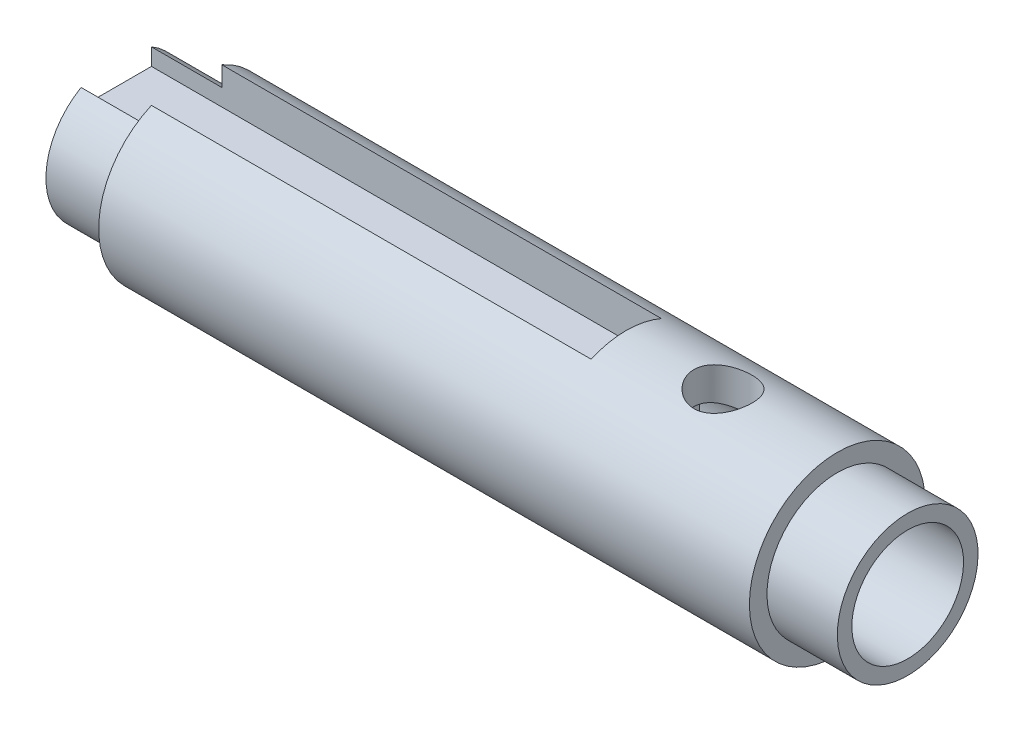
ISO-10303-21;
HEADER;
FILE_DESCRIPTION(('STEP AP214'),'2;1');
FILE_NAME('part.step','',(''),(''),'','','');
FILE_SCHEMA(('AUTOMOTIVE_DESIGN { 1 0 10303 214 1 1 1 1 }'));
ENDSEC;
DATA;
#1=APPLICATION_CONTEXT('core data for automotive mechanical design processes');
#2=APPLICATION_PROTOCOL_DEFINITION('international standard','automotive_design',2000,#1);
#3=PRODUCT_CONTEXT('',#1,'mechanical');
#4=PRODUCT('Part','Part','',(#3));
#5=PRODUCT_RELATED_PRODUCT_CATEGORY('part','',(#4));
#6=PRODUCT_DEFINITION_FORMATION('','',#4);
#7=PRODUCT_DEFINITION_CONTEXT('part definition',#1,'design');
#8=PRODUCT_DEFINITION('design','',#6,#7);
#9=PRODUCT_DEFINITION_SHAPE('','',#8);
#10=(LENGTH_UNIT() NAMED_UNIT(*) SI_UNIT(.MILLI.,.METRE.));
#11=(NAMED_UNIT(*) PLANE_ANGLE_UNIT() SI_UNIT($,.RADIAN.));
#12=(NAMED_UNIT(*) SI_UNIT($,.STERADIAN.) SOLID_ANGLE_UNIT());
#13=UNCERTAINTY_MEASURE_WITH_UNIT(LENGTH_MEASURE(1.E-05),#10,'distance_accuracy_value','');
#14=(GEOMETRIC_REPRESENTATION_CONTEXT(3) GLOBAL_UNCERTAINTY_ASSIGNED_CONTEXT((#13)) GLOBAL_UNIT_ASSIGNED_CONTEXT((#10,
#11,#12)) REPRESENTATION_CONTEXT('',''));
#15=CARTESIAN_POINT('',(0.,0.,0.));
#16=DIRECTION('',(0.,0.,1.));
#17=DIRECTION('',(1.,0.,0.));
#18=AXIS2_PLACEMENT_3D('',#15,#16,#17);
#19=CARTESIAN_POINT('',(22.5,0.,0.));
#20=DIRECTION('',(1.,0.,0.));
#21=DIRECTION('',(0.,1.,0.));
#22=AXIS2_PLACEMENT_3D('',#19,#20,#21);
#23=CYLINDRICAL_SURFACE('',#22,4.);
#24=CARTESIAN_POINT('',(18.5,0.,0.));
#25=DIRECTION('',(1.,0.,0.));
#26=DIRECTION('',(0.,1.,0.));
#27=AXIS2_PLACEMENT_3D('',#24,#25,#26);
#28=CIRCLE('',#27,4.);
#29=CARTESIAN_POINT('',(18.5,4.00000000000001,0.));
#30=VERTEX_POINT('',#29);
#31=EDGE_CURVE('E152',#30,#30,#28,.T.);
#32=ORIENTED_EDGE('',*,*,#31,.T.);
#33=EDGE_LOOP('',(#32));
#34=FACE_BOUND('',#33,.T.);
#35=CARTESIAN_POINT('',(22.5,0.,0.));
#36=DIRECTION('',(1.,0.,0.));
#37=DIRECTION('',(0.,1.,0.));
#38=AXIS2_PLACEMENT_3D('',#35,#36,#37);
#39=CIRCLE('',#38,4.);
#40=CARTESIAN_POINT('',(22.5,4.00000000000001,0.));
#41=VERTEX_POINT('',#40);
#42=EDGE_CURVE('E117',#41,#41,#39,.T.);
#43=ORIENTED_EDGE('',*,*,#42,.F.);
#44=EDGE_LOOP('',(#43));
#45=FACE_BOUND('',#44,.T.);
#46=ADVANCED_FACE('F41',(#34,#45),#23,.T.);
#47=CARTESIAN_POINT('',(22.5,0.,0.));
#48=DIRECTION('',(1.,0.,0.));
#49=DIRECTION('',(0.,1.,0.));
#50=AXIS2_PLACEMENT_3D('',#47,#48,#49);
#51=PLANE('',#50);
#52=CARTESIAN_POINT('',(22.5,0.,0.));
#53=DIRECTION('',(1.,0.,0.));
#54=DIRECTION('',(0.,1.,0.));
#55=AXIS2_PLACEMENT_3D('',#52,#53,#54);
#56=CIRCLE('',#55,3.175);
#57=CARTESIAN_POINT('',(22.5,3.17500000000001,0.));
#58=VERTEX_POINT('',#57);
#59=EDGE_CURVE('E159',#58,#58,#56,.T.);
#60=ORIENTED_EDGE('',*,*,#59,.F.);
#61=EDGE_LOOP('',(#60));
#62=FACE_BOUND('',#61,.T.);
#63=ORIENTED_EDGE('',*,*,#42,.T.);
#64=EDGE_LOOP('',(#63));
#65=FACE_BOUND('',#64,.T.);
#66=ADVANCED_FACE('F141',(#62,#65),#51,.T.);
#67=CARTESIAN_POINT('',(-22.5,0.,0.));
#68=DIRECTION('',(-1.,0.,0.));
#69=DIRECTION('',(0.,-1.,0.));
#70=AXIS2_PLACEMENT_3D('',#67,#68,#69);
#71=PLANE('',#70);
#72=DIRECTION('',(0.,1.,0.));
#73=VECTOR('',#72,1.);
#74=CARTESIAN_POINT('',(-22.5,0.,2.));
#75=LINE('',#74,#73);
#76=CARTESIAN_POINT('',(-22.5,2.49999999999999,2.));
#77=VERTEX_POINT('',#76);
#78=CARTESIAN_POINT('',(-22.5,3.46410161513775,2.));
#79=VERTEX_POINT('',#78);
#80=EDGE_CURVE('E62',#77,#79,#75,.T.);
#81=ORIENTED_EDGE('',*,*,#80,.F.);
#82=DIRECTION('',(0.,0.,1.));
#83=VECTOR('',#82,1.);
#84=CARTESIAN_POINT('',(-22.5,2.49999999999999,0.));
#85=LINE('',#84,#83);
#86=CARTESIAN_POINT('',(-22.5,2.49999999999999,-2.));
#87=VERTEX_POINT('',#86);
#88=EDGE_CURVE('E12',#87,#77,#85,.T.);
#89=ORIENTED_EDGE('',*,*,#88,.F.);
#90=DIRECTION('',(0.,1.,0.));
#91=VECTOR('',#90,1.);
#92=CARTESIAN_POINT('',(-22.5,0.,-2.));
#93=LINE('',#92,#91);
#94=CARTESIAN_POINT('',(-22.5,3.46410161513775,-2.));
#95=VERTEX_POINT('',#94);
#96=EDGE_CURVE('E234',#87,#95,#93,.T.);
#97=ORIENTED_EDGE('',*,*,#96,.T.);
#98=CARTESIAN_POINT('',(-22.5,0.,0.));
#99=DIRECTION('',(1.,0.,0.));
#100=DIRECTION('',(0.,1.,0.));
#101=AXIS2_PLACEMENT_3D('',#98,#99,#100);
#102=CIRCLE('',#101,4.);
#103=EDGE_CURVE('E132',#79,#95,#102,.T.);
#104=ORIENTED_EDGE('',*,*,#103,.F.);
#105=EDGE_LOOP('',(#81,#89,#97,#104));
#106=FACE_BOUND('',#105,.T.);
#107=ADVANCED_FACE('F148',(#106),#71,.T.);
#108=CARTESIAN_POINT('',(22.5,0.,0.));
#109=DIRECTION('',(1.,0.,0.));
#110=DIRECTION('',(0.,1.,0.));
#111=AXIS2_PLACEMENT_3D('',#108,#109,#110);
#112=CYLINDRICAL_SURFACE('',#111,4.);
#113=DIRECTION('',(1.,0.,0.));
#114=VECTOR('',#113,1.);
#115=CARTESIAN_POINT('',(22.5,3.46410161513776,2.));
#116=LINE('',#115,#114);
#117=CARTESIAN_POINT('',(-18.5,3.46410161513775,2.));
#118=VERTEX_POINT('',#117);
#119=EDGE_CURVE('E170',#79,#118,#116,.T.);
#120=ORIENTED_EDGE('',*,*,#119,.F.);
#121=ORIENTED_EDGE('',*,*,#103,.T.);
#122=DIRECTION('',(1.,0.,0.));
#123=VECTOR('',#122,1.);
#124=CARTESIAN_POINT('',(22.5,3.46410161513776,-2.));
#125=LINE('',#124,#123);
#126=CARTESIAN_POINT('',(-18.5,3.46410161513775,-2.));
#127=VERTEX_POINT('',#126);
#128=EDGE_CURVE('E237',#95,#127,#125,.T.);
#129=ORIENTED_EDGE('',*,*,#128,.T.);
#130=CARTESIAN_POINT('',(-18.5,0.,0.));
#131=DIRECTION('',(1.,0.,0.));
#132=DIRECTION('',(0.,1.,0.));
#133=AXIS2_PLACEMENT_3D('',#130,#131,#132);
#134=CIRCLE('',#133,4.);
#135=EDGE_CURVE('E136',#118,#127,#134,.T.);
#136=ORIENTED_EDGE('',*,*,#135,.F.);
#137=EDGE_LOOP('',(#120,#121,#129,#136));
#138=FACE_BOUND('',#137,.T.);
#139=ADVANCED_FACE('F222',(#138),#112,.T.);
#140=CARTESIAN_POINT('',(-18.5,3.99999999999999,0.));
#141=DIRECTION('',(-1.,0.,0.));
#142=DIRECTION('',(0.,-1.,0.));
#143=AXIS2_PLACEMENT_3D('',#140,#141,#142);
#144=PLANE('',#143);
#145=DIRECTION('',(0.,1.,0.));
#146=VECTOR('',#145,1.);
#147=CARTESIAN_POINT('',(-18.5,3.99999999999999,2.));
#148=LINE('',#147,#146);
#149=CARTESIAN_POINT('',(-18.5,4.58257569495583,2.));
#150=VERTEX_POINT('',#149);
#151=EDGE_CURVE('E174',#118,#150,#148,.T.);
#152=ORIENTED_EDGE('',*,*,#151,.F.);
#153=ORIENTED_EDGE('',*,*,#135,.T.);
#154=DIRECTION('',(0.,1.,0.));
#155=VECTOR('',#154,1.);
#156=CARTESIAN_POINT('',(-18.5,3.99999999999999,-2.));
#157=LINE('',#156,#155);
#158=CARTESIAN_POINT('',(-18.5,4.58257569495583,-2.));
#159=VERTEX_POINT('',#158);
#160=EDGE_CURVE('E240',#127,#159,#157,.T.);
#161=ORIENTED_EDGE('',*,*,#160,.T.);
#162=CARTESIAN_POINT('',(-18.5,0.,0.));
#163=DIRECTION('',(1.,0.,0.));
#164=DIRECTION('',(0.,1.,0.));
#165=AXIS2_PLACEMENT_3D('',#162,#163,#164);
#166=CIRCLE('',#165,5.);
#167=EDGE_CURVE('E113',#150,#159,#166,.T.);
#168=ORIENTED_EDGE('',*,*,#167,.F.);
#169=EDGE_LOOP('',(#152,#153,#161,#168));
#170=FACE_BOUND('',#169,.T.);
#171=ADVANCED_FACE('F217',(#170),#144,.T.);
#172=CARTESIAN_POINT('',(22.5,0.,0.));
#173=DIRECTION('',(1.,0.,0.));
#174=DIRECTION('',(0.,1.,0.));
#175=AXIS2_PLACEMENT_3D('',#172,#173,#174);
#176=CYLINDRICAL_SURFACE('',#175,5.);
#177=DIRECTION('',(1.,0.,0.));
#178=VECTOR('',#177,1.);
#179=CARTESIAN_POINT('',(22.5,4.58257569495585,2.));
#180=LINE('',#179,#178);
#181=CARTESIAN_POINT('',(6.5,4.58257569495584,2.));
#182=VERTEX_POINT('',#181);
#183=EDGE_CURVE('E47',#150,#182,#180,.T.);
#184=ORIENTED_EDGE('',*,*,#183,.F.);
#185=ORIENTED_EDGE('',*,*,#167,.T.);
#186=DIRECTION('',(1.,0.,0.));
#187=VECTOR('',#186,1.);
#188=CARTESIAN_POINT('',(22.5,4.58257569495585,-2.));
#189=LINE('',#188,#187);
#190=CARTESIAN_POINT('',(6.5,4.58257569495584,-2.));
#191=VERTEX_POINT('',#190);
#192=EDGE_CURVE('E96',#159,#191,#189,.T.);
#193=ORIENTED_EDGE('',*,*,#192,.T.);
#194=CARTESIAN_POINT('',(6.5,0.,0.));
#195=DIRECTION('',(-1.,0.,0.));
#196=DIRECTION('',(0.,-1.,0.));
#197=AXIS2_PLACEMENT_3D('',#194,#195,#196);
#198=CIRCLE('',#197,5.);
#199=EDGE_CURVE('E102',#182,#191,#198,.T.);
#200=ORIENTED_EDGE('',*,*,#199,.F.);
#201=EDGE_LOOP('',(#184,#185,#193,#200));
#202=FACE_BOUND('',#201,.T.);
#203=CARTESIAN_POINT('',(10.35,5.,0.));
#204=CARTESIAN_POINT('',(10.3499997574856,5.00000012564882,0.0900803323989867));
#205=CARTESIAN_POINT('',(10.357400837485,4.99754312617874,0.180159574077353));
#206=CARTESIAN_POINT('',(10.3867211495276,4.98798348171153,0.357667875169257));
#207=CARTESIAN_POINT('',(10.4086421758353,4.98088026257135,0.44509660565632));
#208=CARTESIAN_POINT('',(10.4661713123883,4.96280068143201,0.614719075952392));
#209=CARTESIAN_POINT('',(10.501756817014,4.95183071876684,0.696921201899964));
#210=CARTESIAN_POINT('',(10.5855035726919,4.92713947248839,0.854190645874481));
#211=CARTESIAN_POINT('',(10.6336672263034,4.91341766335966,0.929256597076052));
#212=CARTESIAN_POINT('',(10.7429248230714,4.88414667976015,1.07267700256014));
#213=CARTESIAN_POINT('',(10.8043700182742,4.86855436886588,1.140755021368));
#214=CARTESIAN_POINT('',(10.9376995139198,4.83753907804007,1.26585047260417));
#215=CARTESIAN_POINT('',(11.0095860466927,4.8221161350793,1.32286553369749));
#216=CARTESIAN_POINT('',(11.1642306123795,4.79271313173334,1.42578155512387));
#217=CARTESIAN_POINT('',(11.2472372375852,4.77878574898836,1.47132547146369));
#218=CARTESIAN_POINT('',(11.4202656308341,4.75460549483772,1.5476895000705));
#219=CARTESIAN_POINT('',(11.5102852973523,4.74435152777497,1.57851400356115));
#220=CARTESIAN_POINT('',(11.6916448290813,4.72913282635101,1.62353134991423));
#221=CARTESIAN_POINT('',(11.7828421633256,4.72400412235767,1.6382413417332));
#222=CARTESIAN_POINT('',(11.966543612694,4.7191313464795,1.65222861163855));
#223=CARTESIAN_POINT('',(12.0590473250677,4.71938564975367,1.65151054662635));
#224=CARTESIAN_POINT('',(12.2383472023923,4.72510629107569,1.63506410098719));
#225=CARTESIAN_POINT('',(12.3252137352388,4.73033928879682,1.62000769651632));
#226=CARTESIAN_POINT('',(12.4951109061667,4.74504632523488,1.57640708934977));
#227=CARTESIAN_POINT('',(12.5781410922653,4.75452086227439,1.54786130181506));
#228=CARTESIAN_POINT('',(12.7395474399946,4.77681173941001,1.47764674240872));
#229=CARTESIAN_POINT('',(12.8178288502253,4.78967871947684,1.43577693123635));
#230=CARTESIAN_POINT('',(12.9664683623015,4.81728315916033,1.34024242388314));
#231=CARTESIAN_POINT('',(13.0368242036941,4.83202114987191,1.28657437554158));
#232=CARTESIAN_POINT('',(13.1713952274102,4.86262798242567,1.16572801734404));
#233=CARTESIAN_POINT('',(13.2351128786431,4.87851612594017,1.09799945388895));
#234=CARTESIAN_POINT('',(13.3504141782392,4.9089733458653,0.952622363558083));
#235=CARTESIAN_POINT('',(13.401996708755,4.92354230068064,0.874972923819716));
#236=CARTESIAN_POINT('',(13.491953516837,4.9499042925994,0.710918878360193));
#237=CARTESIAN_POINT('',(13.530196897213,4.96166947936115,0.624437715003006));
#238=CARTESIAN_POINT('',(13.5914397196063,4.98089634514735,0.445788820584336));
#239=CARTESIAN_POINT('',(13.6144443470641,4.98835948795835,0.353623035566634));
#240=CARTESIAN_POINT('',(13.6436807853833,4.9979000192954,0.17043493694281));
#241=CARTESIAN_POINT('',(13.6505850936395,5.0001932084094,0.0795310449403316));
#242=CARTESIAN_POINT('',(13.6493373673087,4.99978120399321,-0.10215299707419));
#243=CARTESIAN_POINT('',(13.6411878171332,4.99707683523428,-0.19293316503069));
#244=CARTESIAN_POINT('',(13.6105971738171,4.98711592890817,-0.369117276094976));
#245=CARTESIAN_POINT('',(13.5885667899855,4.97999029806496,-0.454600657078433));
#246=CARTESIAN_POINT('',(13.5313513084882,4.96203610216641,-0.620625393385987));
#247=CARTESIAN_POINT('',(13.4961645401181,4.9512070668376,-0.701166119538831));
#248=CARTESIAN_POINT('',(13.4126189804476,4.92659738190257,-0.857353583850655));
#249=CARTESIAN_POINT('',(13.3639413852355,4.91274728599484,-0.932818538636807));
#250=CARTESIAN_POINT('',(13.2551717652041,4.8836680633903,-1.07472879779132));
#251=CARTESIAN_POINT('',(13.195076316326,4.86843852373584,-1.14117138619964));
#252=CARTESIAN_POINT('',(13.062013827308,4.83745909847492,-1.26622547851876));
#253=CARTESIAN_POINT('',(12.9885931330763,4.82171620160003,-1.32435715949936));
#254=CARTESIAN_POINT('',(12.8327001451063,4.79218567046633,-1.42753142742357));
#255=CARTESIAN_POINT('',(12.7502278168408,4.77839804366633,-1.47257396443646));
#256=CARTESIAN_POINT('',(12.5785745160417,4.75447746870334,-1.54806908435207));
#257=CARTESIAN_POINT('',(12.4894100140228,4.74433588191366,-1.57855621066784));
#258=CARTESIAN_POINT('',(12.3068020979204,4.728992662468,-1.62395003915295));
#259=CARTESIAN_POINT('',(12.213360579788,4.72378886275909,-1.63886357641239));
#260=CARTESIAN_POINT('',(12.0299145750871,4.71915352744858,-1.65216049477083));
#261=CARTESIAN_POINT('',(11.9399740636218,4.71944442417867,-1.6513387236508));
#262=CARTESIAN_POINT('',(11.7615834004099,4.72508139490563,-1.63513842564513));
#263=CARTESIAN_POINT('',(11.6731331635849,4.7304271793221,-1.61976073262755));
#264=CARTESIAN_POINT('',(11.5018358628154,4.74536693764462,-1.57544291875231));
#265=CARTESIAN_POINT('',(11.4189160278425,4.75488165289365,-1.54675527092969));
#266=CARTESIAN_POINT('',(11.2590025073374,4.77705935615134,-1.47683540940045));
#267=CARTESIAN_POINT('',(11.1820101250481,4.78972303393434,-1.43560044678476));
#268=CARTESIAN_POINT('',(11.0325565456336,4.81744939348764,-1.33969084183065));
#269=CARTESIAN_POINT('',(10.9604315889302,4.8325917044349,-1.28451538865981));
#270=CARTESIAN_POINT('',(10.826207419325,4.86323043063064,-1.16314331347536));
#271=CARTESIAN_POINT('',(10.7641110248733,4.87872694403302,-1.09694360376003));
#272=CARTESIAN_POINT('',(10.6493366681908,4.90903317548774,-0.952387676734107));
#273=CARTESIAN_POINT('',(10.5971049783148,4.92379458911327,-0.873665758138171));
#274=CARTESIAN_POINT('',(10.5066751421022,4.95031750248797,-0.708077082051268));
#275=CARTESIAN_POINT('',(10.4684730828886,4.96207983840249,-0.621212604024479));
#276=CARTESIAN_POINT('',(10.4089869849695,4.98076953032462,-0.446386541872211));
#277=CARTESIAN_POINT('',(10.386936477516,4.98791371763215,-0.358709155083951));
#278=CARTESIAN_POINT('',(10.3574450279568,4.99752827480817,-0.180687007883427));
#279=CARTESIAN_POINT('',(10.3500002432214,4.99999987398486,-0.0903429553968472));
#280=CARTESIAN_POINT('',(10.35,5.,0.));
#281=B_SPLINE_CURVE_WITH_KNOTS('',3,(#203,#204,#205,#206,#207,#208,#209,#210,#211,#212,#213,
#214,#215,#216,#217,#218,#219,#220,#221,#222,#223,#224,#225,#226,#227,#228,#229,#230,#231,#232,
#233,#234,#235,#236,#237,#238,#239,#240,#241,#242,#243,#244,#245,#246,#247,#248,#249,#250,#251,
#252,#253,#254,#255,#256,#257,#258,#259,#260,#261,#262,#263,#264,#265,#266,#267,#268,#269,#270,
#271,#272,#273,#274,#275,#276,#277,#278,#279,#280),.UNSPECIFIED.,.T.,.F.,(4,2,2,2,2,2,2,2,2,2,2,
2,2,2,2,2,2,2,2,2,2,2,2,2,2,2,2,2,2,2,2,2,2,2,2,2,2,2,4),(0.,0.269908604132499,
0.539850567737246,0.809347867689092,1.07889668217443,1.35671215765951,1.63458711701568,
1.92026489148116,2.20585738673401,2.48198869358466,2.75803665240172,3.02175295330503,
3.28550024538371,3.55343249441285,3.82144096800203,4.10314526837294,4.38487550826385,
4.66929734218007,4.95362234329173,5.22584041060145,5.49801355645391,5.76248915124946,
6.02699834271653,6.29838751507403,6.56985820217366,6.85340472718152,7.13695233381084,
7.41982362841784,7.70257072144069,7.97107468624607,8.23956327014093,8.50315503612408,
8.76680459233089,9.04176838412559,9.31680931840235,9.60227659952694,9.88766420298742,
10.1584309528124,10.4291264568694),.UNSPECIFIED.);
#282=CARTESIAN_POINT('',(10.35,5.,0.));
#283=VERTEX_POINT('',#282);
#284=EDGE_CURVE('E114',#283,#283,#281,.T.);
#285=ORIENTED_EDGE('',*,*,#284,.F.);
#286=EDGE_LOOP('',(#285));
#287=FACE_BOUND('',#286,.T.);
#288=CARTESIAN_POINT('',(18.5,0.,0.));
#289=DIRECTION('',(1.,0.,0.));
#290=DIRECTION('',(0.,1.,0.));
#291=AXIS2_PLACEMENT_3D('',#288,#289,#290);
#292=CIRCLE('',#291,5.);
#293=CARTESIAN_POINT('',(18.5,5.00000000000001,0.));
#294=VERTEX_POINT('',#293);
#295=EDGE_CURVE('E154',#294,#294,#292,.T.);
#296=ORIENTED_EDGE('',*,*,#295,.F.);
#297=EDGE_LOOP('',(#296));
#298=FACE_BOUND('',#297,.T.);
#299=ADVANCED_FACE('F110',(#202,#287,#298),#176,.T.);
#300=CARTESIAN_POINT('',(18.5,4.00000000000001,0.));
#301=DIRECTION('',(1.,0.,0.));
#302=DIRECTION('',(0.,1.,0.));
#303=AXIS2_PLACEMENT_3D('',#300,#301,#302);
#304=PLANE('',#303);
#305=ORIENTED_EDGE('',*,*,#295,.T.);
#306=EDGE_LOOP('',(#305));
#307=FACE_BOUND('',#306,.T.);
#308=ORIENTED_EDGE('',*,*,#31,.F.);
#309=EDGE_LOOP('',(#308));
#310=FACE_BOUND('',#309,.T.);
#311=ADVANCED_FACE('F201',(#307,#310),#304,.T.);
#312=CARTESIAN_POINT('',(7.5,0.,0.));
#313=DIRECTION('',(1.,0.,0.));
#314=DIRECTION('',(0.,1.,0.));
#315=AXIS2_PLACEMENT_3D('',#312,#313,#314);
#316=CYLINDRICAL_SURFACE('',#315,3.175);
#317=CARTESIAN_POINT('',(10.35,3.175,0.));
#318=CARTESIAN_POINT('',(10.3500056079565,3.17499505072987,0.0863288456326064));
#319=CARTESIAN_POINT('',(10.3568147744306,3.17144199402365,0.172748082059083));
#320=CARTESIAN_POINT('',(10.3837377897262,3.15757827840902,0.34300620977565));
#321=CARTESIAN_POINT('',(10.4038741979,3.14725616161683,0.426840473151071));
#322=CARTESIAN_POINT('',(10.4564381177141,3.12092848257844,0.589211374045223));
#323=CARTESIAN_POINT('',(10.4888166585286,3.10494558044068,0.667767668913881));
#324=CARTESIAN_POINT('',(10.5646778196976,3.06874009265734,0.818201782224421));
#325=CARTESIAN_POINT('',(10.6081601218172,3.04851762852102,0.890079791986143));
#326=CARTESIAN_POINT('',(10.7081371657511,3.00414727626075,1.0302764851221));
#327=CARTESIAN_POINT('',(10.7652853375622,2.97983121925871,1.09807511856644));
#328=CARTESIAN_POINT('',(10.8895547069123,2.93052200356347,1.22361064753918));
#329=CARTESIAN_POINT('',(10.9566840795454,2.90552830369848,1.28133921015419));
#330=CARTESIAN_POINT('',(11.105870513951,2.85521488514068,1.39005780085114));
#331=CARTESIAN_POINT('',(11.1887130123632,2.83004983246423,1.44005038752232));
#332=CARTESIAN_POINT('',(11.3630554315894,2.78509705834675,1.52518575600505));
#333=CARTESIAN_POINT('',(11.4545487790751,2.76530529759573,1.56033970368239));
#334=CARTESIAN_POINT('',(11.6378950583068,2.73525125469313,1.61241612807522));
#335=CARTESIAN_POINT('',(11.7293783004104,2.72447683690935,1.63032870241774));
#336=CARTESIAN_POINT('',(11.9146315463125,2.7123631367979,1.65041375344092));
#337=CARTESIAN_POINT('',(12.0083988180116,2.71101308866366,1.65260419018252));
#338=CARTESIAN_POINT('',(12.1822454502874,2.71749559707493,1.64190642931167));
#339=CARTESIAN_POINT('',(12.2625003964916,2.7241416367145,1.63096705490198));
#340=CARTESIAN_POINT('',(12.4198142482997,2.74376959937903,1.59772412376283));
#341=CARTESIAN_POINT('',(12.4968719770454,2.75675383336014,1.57541642192005));
#342=CARTESIAN_POINT('',(12.6478000487477,2.78786252488853,1.51969740066464));
#343=CARTESIAN_POINT('',(12.7215566462365,2.80609811745903,1.48604299006153));
#344=CARTESIAN_POINT('',(12.8627420456755,2.84567172377063,1.40877957111467));
#345=CARTESIAN_POINT('',(12.9301679927661,2.86701112624824,1.36516610178818));
#346=CARTESIAN_POINT('',(13.066605117625,2.91395184841571,1.26219363296329));
#347=CARTESIAN_POINT('',(13.1345433737606,2.93973419319173,1.20149067627236));
#348=CARTESIAN_POINT('',(13.259743599097,2.99028352285429,1.06949807216656));
#349=CARTESIAN_POINT('',(13.31699965836,3.0150499398017,0.99820260338082));
#350=CARTESIAN_POINT('',(13.4221395945346,3.06239833689467,0.842215729793853));
#351=CARTESIAN_POINT('',(13.4693521562786,3.08479068244345,0.757009480815105));
#352=CARTESIAN_POINT('',(13.5483713504233,3.12320055261165,0.578409880932615));
#353=CARTESIAN_POINT('',(13.5801911168124,3.13922350985849,0.485023590349087));
#354=CARTESIAN_POINT('',(13.6247382765902,3.1618929684137,0.301424850405785));
#355=CARTESIAN_POINT('',(13.6388868608851,3.16923442880762,0.211644081258463));
#356=CARTESIAN_POINT('',(13.6522026723972,3.17613950193604,0.0306980246370349));
#357=CARTESIAN_POINT('',(13.6513778835395,3.17570725967355,-0.0604664990981065));
#358=CARTESIAN_POINT('',(13.635527779133,3.16749754931548,-0.233316980710388));
#359=CARTESIAN_POINT('',(13.6217178218068,3.16034876631346,-0.3151489623336));
#360=CARTESIAN_POINT('',(13.5822527097377,3.14028034254955,-0.475150242718686));
#361=CARTESIAN_POINT('',(13.5565962936485,3.12736008727764,-0.553319150480023));
#362=CARTESIAN_POINT('',(13.4935813836596,3.09647180446975,-0.706212939280996));
#363=CARTESIAN_POINT('',(13.4559294015846,3.07837849351248,-0.780790630451235));
#364=CARTESIAN_POINT('',(13.3703371123435,3.03883348654069,-0.922798990984224));
#365=CARTESIAN_POINT('',(13.3223926143017,3.01738042347771,-0.990226732294096));
#366=CARTESIAN_POINT('',(13.2118473363396,2.97051129977894,-1.12346696056841));
#367=CARTESIAN_POINT('',(13.1482411793532,2.94491509095218,-1.18838319198266));
#368=CARTESIAN_POINT('',(13.0111026504004,2.89420006415324,-1.30705950166707));
#369=CARTESIAN_POINT('',(12.9375621273933,2.86908165772535,-1.36081032595766));
#370=CARTESIAN_POINT('',(12.777217683471,2.82064166280039,-1.45868586616518));
#371=CARTESIAN_POINT('',(12.6898860180691,2.79751477508171,-1.5020513398829));
#372=CARTESIAN_POINT('',(12.5075999661366,2.75824552844262,-1.57301408971573));
#373=CARTESIAN_POINT('',(12.4126562866029,2.74209355614627,-1.60063308579739));
#374=CARTESIAN_POINT('',(12.2277148079658,2.72073397702698,-1.6366526208553));
#375=CARTESIAN_POINT('',(12.138140282623,2.71461115428773,-1.6466673965615));
#376=CARTESIAN_POINT('',(11.9584177654956,2.71142086136596,-1.65191965806436));
#377=CARTESIAN_POINT('',(11.8682701267278,2.71434827131427,-1.64716549888903));
#378=CARTESIAN_POINT('',(11.7005004282466,2.72792811118478,-1.62455190222244));
#379=CARTESIAN_POINT('',(11.6225937373491,2.73769263356809,-1.60819619302194));
#380=CARTESIAN_POINT('',(11.4707488647697,2.76271895398112,-1.56481064042944));
#381=CARTESIAN_POINT('',(11.3968120684376,2.77798265688342,-1.53777709800759));
#382=CARTESIAN_POINT('',(11.2495666977159,2.81350803687632,-1.47183030022051));
#383=CARTESIAN_POINT('',(11.1766224854284,2.83403332991857,-1.43225007776854));
#384=CARTESIAN_POINT('',(11.0379248413719,2.8773886681579,-1.34302626148151));
#385=CARTESIAN_POINT('',(10.9721752932031,2.90021994543856,-1.29337727349087));
#386=CARTESIAN_POINT('',(10.8404877116796,2.9492999139497,-1.17758996129411));
#387=CARTESIAN_POINT('',(10.7757217026665,2.97559398358101,-1.1101305728642));
#388=CARTESIAN_POINT('',(10.6581116196618,3.02588178787174,-0.964667870386815));
#389=CARTESIAN_POINT('',(10.6052746694978,3.0498741430953,-0.886658300178438));
#390=CARTESIAN_POINT('',(10.5124482542983,3.09341655888198,-0.720351736157363));
#391=CARTESIAN_POINT('',(10.4726864726555,3.11288631790362,-0.631905543674001));
#392=CARTESIAN_POINT('',(10.4091365260247,3.14455148561551,-0.448359444233514));
#393=CARTESIAN_POINT('',(10.3853044933178,3.15676686115213,-0.353278613099311));
#394=CARTESIAN_POINT('',(10.3634069749133,3.16804947609633,-0.214273226426304));
#395=CARTESIAN_POINT('',(10.3583877860301,3.17064787670482,-0.171623628363415));
#396=CARTESIAN_POINT('',(10.3516828634887,3.17412439117156,-0.0859901694433891));
#397=CARTESIAN_POINT('',(10.3499972062934,3.17500246556988,-0.043006300941636));
#398=CARTESIAN_POINT('',(10.35,3.175,0.));
#399=B_SPLINE_CURVE_WITH_KNOTS('',3,(#317,#318,#319,#320,#321,#322,#323,#324,#325,#326,#327,
#328,#329,#330,#331,#332,#333,#334,#335,#336,#337,#338,#339,#340,#341,#342,#343,#344,#345,#346,
#347,#348,#349,#350,#351,#352,#353,#354,#355,#356,#357,#358,#359,#360,#361,#362,#363,#364,#365,
#366,#367,#368,#369,#370,#371,#372,#373,#374,#375,#376,#377,#378,#379,#380,#381,#382,#383,#384,
#385,#386,#387,#388,#389,#390,#391,#392,#393,#394,#395,#396,#397,#398),.UNSPECIFIED.,.T.,.F.,(4,
2,2,2,2,2,2,2,2,2,2,2,2,2,2,2,2,2,2,2,2,2,2,2,2,2,2,2,2,2,2,2,2,2,2,2,2,2,2,2,4),(0.,
0.258812639959759,0.51806450280917,0.776290097153166,1.03450829155513,1.30920871118935,
1.58413537617049,1.88255645928857,2.18075258270928,2.46057054013292,2.74006879875385,
2.98273863505733,3.22549701687856,3.47382700917836,3.72226845543168,4.00510588014549,
4.28809932394922,4.58634272186329,4.88433119110175,5.15637271535242,5.42826918909886,
5.67700982508987,5.92577695173242,6.1811701012791,6.43666743895274,6.71871967957098,
7.00100476277757,7.30001876037766,7.59861930772336,7.86804172496084,8.13731175329199,
8.37687413371432,8.61651957655826,8.87200077334421,9.12761920276589,9.41773424708266,
9.70802208750468,10.0031258310574,10.2974135255293,10.4263428411207,10.5552751139901),.UNSPECIFIED.);
#400=CARTESIAN_POINT('',(10.35,3.175,0.));
#401=VERTEX_POINT('',#400);
#402=EDGE_CURVE('E177',#401,#401,#399,.T.);
#403=ORIENTED_EDGE('',*,*,#402,.T.);
#404=EDGE_LOOP('',(#403));
#405=FACE_BOUND('',#404,.T.);
#406=CARTESIAN_POINT('',(7.5,0.,0.));
#407=DIRECTION('',(1.,0.,0.));
#408=DIRECTION('',(0.,1.,0.));
#409=AXIS2_PLACEMENT_3D('',#406,#407,#408);
#410=CIRCLE('',#409,3.175);
#411=CARTESIAN_POINT('',(7.5,3.175,0.));
#412=VERTEX_POINT('',#411);
#413=EDGE_CURVE('E155',#412,#412,#410,.T.);
#414=ORIENTED_EDGE('',*,*,#413,.F.);
#415=EDGE_LOOP('',(#414));
#416=FACE_BOUND('',#415,.T.);
#417=ORIENTED_EDGE('',*,*,#59,.T.);
#418=EDGE_LOOP('',(#417));
#419=FACE_BOUND('',#418,.T.);
#420=ADVANCED_FACE('F183',(#405,#416,#419),#316,.F.);
#421=CARTESIAN_POINT('',(7.5,0.,0.));
#422=DIRECTION('',(1.,0.,0.));
#423=DIRECTION('',(0.,1.,0.));
#424=AXIS2_PLACEMENT_3D('',#421,#422,#423);
#425=PLANE('',#424);
#426=ORIENTED_EDGE('',*,*,#413,.T.);
#427=EDGE_LOOP('',(#426));
#428=FACE_BOUND('',#427,.T.);
#429=ADVANCED_FACE('F192',(#428),#425,.T.);
#430=CARTESIAN_POINT('',(12.,5.,0.));
#431=DIRECTION('',(0.,1.,0.));
#432=DIRECTION('',(0.,0.,1.));
#433=AXIS2_PLACEMENT_3D('',#430,#431,#432);
#434=CYLINDRICAL_SURFACE('',#433,1.64999999999999);
#435=ORIENTED_EDGE('',*,*,#284,.T.);
#436=EDGE_LOOP('',(#435));
#437=FACE_BOUND('',#436,.T.);
#438=ORIENTED_EDGE('',*,*,#402,.F.);
#439=EDGE_LOOP('',(#438));
#440=FACE_BOUND('',#439,.T.);
#441=ADVANCED_FACE('F187',(#437,#440),#434,.F.);
#442=CARTESIAN_POINT('',(-43.5,0.,2.));
#443=DIRECTION('',(0.,0.,1.));
#444=DIRECTION('',(0.,-1.,0.));
#445=AXIS2_PLACEMENT_3D('',#442,#443,#444);
#446=PLANE('',#445);
#447=ORIENTED_EDGE('',*,*,#80,.T.);
#448=ORIENTED_EDGE('',*,*,#119,.T.);
#449=ORIENTED_EDGE('',*,*,#151,.T.);
#450=ORIENTED_EDGE('',*,*,#183,.T.);
#451=DIRECTION('',(0.,-1.,0.));
#452=VECTOR('',#451,1.);
#453=CARTESIAN_POINT('',(6.5,0.,2.));
#454=LINE('',#453,#452);
#455=CARTESIAN_POINT('',(6.5,2.5,2.));
#456=VERTEX_POINT('',#455);
#457=EDGE_CURVE('E54',#182,#456,#454,.T.);
#458=ORIENTED_EDGE('',*,*,#457,.T.);
#459=DIRECTION('',(1.,0.,0.));
#460=VECTOR('',#459,1.);
#461=CARTESIAN_POINT('',(-43.5,2.49999999999999,2.));
#462=LINE('',#461,#460);
#463=EDGE_CURVE('E245',#77,#456,#462,.T.);
#464=ORIENTED_EDGE('',*,*,#463,.F.);
#465=EDGE_LOOP('',(#447,#448,#449,#450,#458,#464));
#466=FACE_BOUND('',#465,.T.);
#467=ADVANCED_FACE('F191',(#466),#446,.F.);
#468=CARTESIAN_POINT('',(-43.5,0.,-2.));
#469=DIRECTION('',(0.,0.,1.));
#470=DIRECTION('',(0.,-1.,0.));
#471=AXIS2_PLACEMENT_3D('',#468,#469,#470);
#472=PLANE('',#471);
#473=DIRECTION('',(1.,0.,0.));
#474=VECTOR('',#473,1.);
#475=CARTESIAN_POINT('',(-43.5,2.49999999999999,-2.));
#476=LINE('',#475,#474);
#477=CARTESIAN_POINT('',(6.5,2.5,-2.));
#478=VERTEX_POINT('',#477);
#479=EDGE_CURVE('E99',#87,#478,#476,.T.);
#480=ORIENTED_EDGE('',*,*,#479,.T.);
#481=DIRECTION('',(0.,-1.,0.));
#482=VECTOR('',#481,1.);
#483=CARTESIAN_POINT('',(6.5,0.,-2.));
#484=LINE('',#483,#482);
#485=EDGE_CURVE('E93',#191,#478,#484,.T.);
#486=ORIENTED_EDGE('',*,*,#485,.F.);
#487=ORIENTED_EDGE('',*,*,#192,.F.);
#488=ORIENTED_EDGE('',*,*,#160,.F.);
#489=ORIENTED_EDGE('',*,*,#128,.F.);
#490=ORIENTED_EDGE('',*,*,#96,.F.);
#491=EDGE_LOOP('',(#480,#486,#487,#488,#489,#490));
#492=FACE_BOUND('',#491,.T.);
#493=ADVANCED_FACE('F94',(#492),#472,.T.);
#494=CARTESIAN_POINT('',(-43.5,2.49999999999999,0.));
#495=DIRECTION('',(0.,-1.,0.));
#496=DIRECTION('',(1.,0.,0.));
#497=AXIS2_PLACEMENT_3D('',#494,#495,#496);
#498=PLANE('',#497);
#499=ORIENTED_EDGE('',*,*,#88,.T.);
#500=ORIENTED_EDGE('',*,*,#463,.T.);
#501=DIRECTION('',(0.,0.,-1.));
#502=VECTOR('',#501,1.);
#503=CARTESIAN_POINT('',(6.5,2.5,0.));
#504=LINE('',#503,#502);
#505=EDGE_CURVE('E101',#456,#478,#504,.T.);
#506=ORIENTED_EDGE('',*,*,#505,.T.);
#507=ORIENTED_EDGE('',*,*,#479,.F.);
#508=EDGE_LOOP('',(#499,#500,#506,#507));
#509=FACE_BOUND('',#508,.T.);
#510=ADVANCED_FACE('F249',(#509),#498,.F.);
#511=CARTESIAN_POINT('',(6.5,0.,0.));
#512=DIRECTION('',(-1.,0.,0.));
#513=DIRECTION('',(0.,-1.,0.));
#514=AXIS2_PLACEMENT_3D('',#511,#512,#513);
#515=PLANE('',#514);
#516=ORIENTED_EDGE('',*,*,#457,.F.);
#517=ORIENTED_EDGE('',*,*,#199,.T.);
#518=ORIENTED_EDGE('',*,*,#485,.T.);
#519=ORIENTED_EDGE('',*,*,#505,.F.);
#520=EDGE_LOOP('',(#516,#517,#518,#519));
#521=FACE_BOUND('',#520,.T.);
#522=ADVANCED_FACE('F105',(#521),#515,.T.);
#523=CLOSED_SHELL('',(#46,#66,#107,#139,#171,#299,#311,#420,#429,#441,#467,#493,#510,#522));
#524=MANIFOLD_SOLID_BREP('B2',#523);
#525=ADVANCED_BREP_SHAPE_REPRESENTATION('',(#18,#524),#14);
#526=SHAPE_DEFINITION_REPRESENTATION(#9,#525);
ENDSEC;
END-ISO-10303-21;
